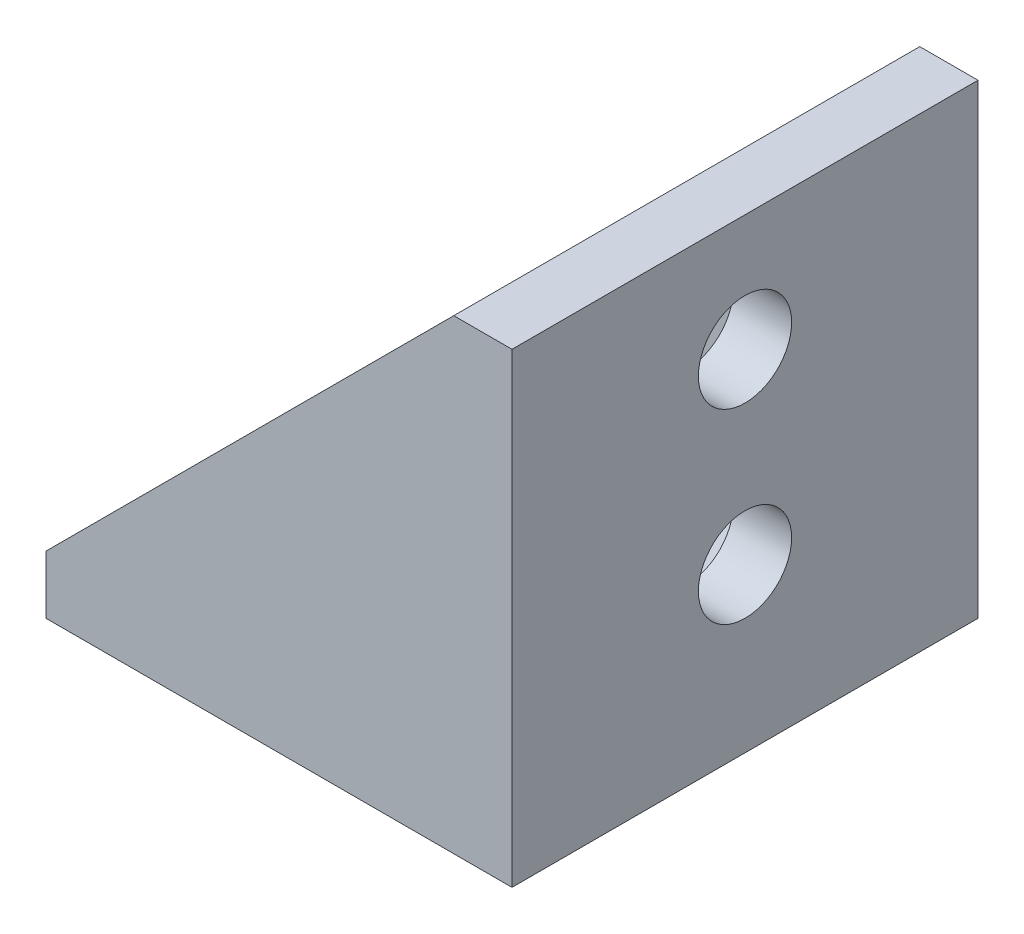
ISO-10303-21;
HEADER;
FILE_DESCRIPTION(('STEP AP214'),'2;1');
FILE_NAME('part.step','',(''),(''),'','','');
FILE_SCHEMA(('AUTOMOTIVE_DESIGN { 1 0 10303 214 1 1 1 1 }'));
ENDSEC;
DATA;
#1=APPLICATION_CONTEXT('core data for automotive mechanical design processes');
#2=APPLICATION_PROTOCOL_DEFINITION('international standard','automotive_design',2000,#1);
#3=PRODUCT_CONTEXT('',#1,'mechanical');
#4=PRODUCT('Part','Part','',(#3));
#5=PRODUCT_RELATED_PRODUCT_CATEGORY('part','',(#4));
#6=PRODUCT_DEFINITION_FORMATION('','',#4);
#7=PRODUCT_DEFINITION_CONTEXT('part definition',#1,'design');
#8=PRODUCT_DEFINITION('design','',#6,#7);
#9=PRODUCT_DEFINITION_SHAPE('','',#8);
#10=(LENGTH_UNIT() NAMED_UNIT(*) SI_UNIT(.MILLI.,.METRE.));
#11=(NAMED_UNIT(*) PLANE_ANGLE_UNIT() SI_UNIT($,.RADIAN.));
#12=(NAMED_UNIT(*) SI_UNIT($,.STERADIAN.) SOLID_ANGLE_UNIT());
#13=UNCERTAINTY_MEASURE_WITH_UNIT(LENGTH_MEASURE(1.E-05),#10,'distance_accuracy_value','');
#14=(GEOMETRIC_REPRESENTATION_CONTEXT(3) GLOBAL_UNCERTAINTY_ASSIGNED_CONTEXT((#13)) GLOBAL_UNIT_ASSIGNED_CONTEXT((#10,
#11,#12)) REPRESENTATION_CONTEXT('',''));
#15=CARTESIAN_POINT('',(0.,0.,0.));
#16=DIRECTION('',(0.,0.,1.));
#17=DIRECTION('',(1.,0.,0.));
#18=AXIS2_PLACEMENT_3D('',#15,#16,#17);
#19=CARTESIAN_POINT('',(17.5,20.,-20.));
#20=DIRECTION('',(-0.707106781186548,0.707106781186548,0.));
#21=DIRECTION('',(-0.707106781186548,-0.707106781186548,0.));
#22=AXIS2_PLACEMENT_3D('',#19,#20,#21);
#23=PLANE('',#22);
#24=DIRECTION('',(0.,0.,1.));
#25=VECTOR('',#24,1.);
#26=CARTESIAN_POINT('',(0.,2.5,-20.));
#27=LINE('',#26,#25);
#28=CARTESIAN_POINT('',(0.,2.5,-20.));
#29=VERTEX_POINT('',#28);
#30=CARTESIAN_POINT('',(0.,2.5,-18.3));
#31=VERTEX_POINT('',#30);
#32=EDGE_CURVE('E59',#29,#31,#27,.T.);
#33=ORIENTED_EDGE('',*,*,#32,.T.);
#34=DIRECTION('',(0.707106781186548,0.707106781186548,0.));
#35=VECTOR('',#34,1.);
#36=CARTESIAN_POINT('',(17.5,20.,-18.3));
#37=LINE('',#36,#35);
#38=CARTESIAN_POINT('',(17.5,20.,-18.3));
#39=VERTEX_POINT('',#38);
#40=EDGE_CURVE('E11',#31,#39,#37,.T.);
#41=ORIENTED_EDGE('',*,*,#40,.T.);
#42=DIRECTION('',(0.,0.,1.));
#43=VECTOR('',#42,1.);
#44=CARTESIAN_POINT('',(17.5,20.,-20.));
#45=LINE('',#44,#43);
#46=CARTESIAN_POINT('',(17.5,20.,-20.));
#47=VERTEX_POINT('',#46);
#48=EDGE_CURVE('E148',#47,#39,#45,.T.);
#49=ORIENTED_EDGE('',*,*,#48,.F.);
#50=DIRECTION('',(-0.707106781186548,-0.707106781186548,0.));
#51=VECTOR('',#50,1.);
#52=CARTESIAN_POINT('',(17.5,20.,-20.));
#53=LINE('',#52,#51);
#54=EDGE_CURVE('E124',#47,#29,#53,.T.);
#55=ORIENTED_EDGE('',*,*,#54,.T.);
#56=EDGE_LOOP('',(#33,#41,#49,#55));
#57=FACE_BOUND('',#56,.T.);
#58=ADVANCED_FACE('F35',(#57),#23,.T.);
#59=CARTESIAN_POINT('',(17.5,20.,-1.7));
#60=VERTEX_POINT('',#59);
#61=CARTESIAN_POINT('',(17.5,20.,0.));
#62=VERTEX_POINT('',#61);
#63=EDGE_CURVE('E116',#60,#62,#45,.T.);
#64=ORIENTED_EDGE('',*,*,#63,.F.);
#65=DIRECTION('',(-0.707106781186548,-0.707106781186548,0.));
#66=VECTOR('',#65,1.);
#67=CARTESIAN_POINT('',(17.5,20.,-1.7));
#68=LINE('',#67,#66);
#69=CARTESIAN_POINT('',(0.,2.5,-1.7));
#70=VERTEX_POINT('',#69);
#71=EDGE_CURVE('E43',#60,#70,#68,.T.);
#72=ORIENTED_EDGE('',*,*,#71,.T.);
#73=CARTESIAN_POINT('',(0.,2.5,0.));
#74=VERTEX_POINT('',#73);
#75=EDGE_CURVE('E85',#70,#74,#27,.T.);
#76=ORIENTED_EDGE('',*,*,#75,.T.);
#77=DIRECTION('',(-0.707106781186548,-0.707106781186548,0.));
#78=VECTOR('',#77,1.);
#79=CARTESIAN_POINT('',(17.5,20.,0.));
#80=LINE('',#79,#78);
#81=EDGE_CURVE('E144',#62,#74,#80,.T.);
#82=ORIENTED_EDGE('',*,*,#81,.F.);
#83=EDGE_LOOP('',(#64,#72,#76,#82));
#84=FACE_BOUND('',#83,.T.);
#85=ADVANCED_FACE('F153',(#84),#23,.T.);
#86=CARTESIAN_POINT('',(0.,2.5,-20.));
#87=DIRECTION('',(-1.,0.,0.));
#88=DIRECTION('',(0.,-1.,0.));
#89=AXIS2_PLACEMENT_3D('',#86,#87,#88);
#90=PLANE('',#89);
#91=DIRECTION('',(0.,-1.,0.));
#92=VECTOR('',#91,1.);
#93=CARTESIAN_POINT('',(0.,2.5,0.));
#94=LINE('',#93,#92);
#95=CARTESIAN_POINT('',(0.,0.,0.));
#96=VERTEX_POINT('',#95);
#97=EDGE_CURVE('E134',#74,#96,#94,.T.);
#98=ORIENTED_EDGE('',*,*,#97,.F.);
#99=ORIENTED_EDGE('',*,*,#75,.F.);
#100=DIRECTION('',(0.,0.,-1.));
#101=VECTOR('',#100,1.);
#102=CARTESIAN_POINT('',(0.,2.5,-20.));
#103=LINE('',#102,#101);
#104=EDGE_CURVE('E160',#70,#31,#103,.T.);
#105=ORIENTED_EDGE('',*,*,#104,.T.);
#106=ORIENTED_EDGE('',*,*,#32,.F.);
#107=DIRECTION('',(0.,-1.,0.));
#108=VECTOR('',#107,1.);
#109=CARTESIAN_POINT('',(0.,2.5,-20.));
#110=LINE('',#109,#108);
#111=CARTESIAN_POINT('',(0.,0.,-20.));
#112=VERTEX_POINT('',#111);
#113=EDGE_CURVE('E129',#29,#112,#110,.T.);
#114=ORIENTED_EDGE('',*,*,#113,.T.);
#115=DIRECTION('',(0.,0.,1.));
#116=VECTOR('',#115,1.);
#117=CARTESIAN_POINT('',(0.,0.,-20.));
#118=LINE('',#117,#116);
#119=EDGE_CURVE('E93',#112,#96,#118,.T.);
#120=ORIENTED_EDGE('',*,*,#119,.T.);
#121=EDGE_LOOP('',(#98,#99,#105,#106,#114,#120));
#122=FACE_BOUND('',#121,.T.);
#123=ADVANCED_FACE('F37',(#122),#90,.T.);
#124=CARTESIAN_POINT('',(20.,20.,-20.));
#125=DIRECTION('',(0.,1.,0.));
#126=DIRECTION('',(0.,0.,1.));
#127=AXIS2_PLACEMENT_3D('',#124,#125,#126);
#128=PLANE('',#127);
#129=DIRECTION('',(-1.,0.,0.));
#130=VECTOR('',#129,1.);
#131=CARTESIAN_POINT('',(20.,20.,0.));
#132=LINE('',#131,#130);
#133=CARTESIAN_POINT('',(20.,20.,0.));
#134=VERTEX_POINT('',#133);
#135=EDGE_CURVE('E111',#134,#62,#132,.T.);
#136=ORIENTED_EDGE('',*,*,#135,.F.);
#137=DIRECTION('',(0.,0.,1.));
#138=VECTOR('',#137,1.);
#139=CARTESIAN_POINT('',(20.,20.,-20.));
#140=LINE('',#139,#138);
#141=CARTESIAN_POINT('',(20.,20.,-20.));
#142=VERTEX_POINT('',#141);
#143=EDGE_CURVE('E104',#142,#134,#140,.T.);
#144=ORIENTED_EDGE('',*,*,#143,.F.);
#145=DIRECTION('',(-1.,0.,0.));
#146=VECTOR('',#145,1.);
#147=CARTESIAN_POINT('',(20.,20.,-20.));
#148=LINE('',#147,#146);
#149=EDGE_CURVE('E108',#142,#47,#148,.T.);
#150=ORIENTED_EDGE('',*,*,#149,.T.);
#151=ORIENTED_EDGE('',*,*,#48,.T.);
#152=DIRECTION('',(0.,0.,1.));
#153=VECTOR('',#152,1.);
#154=CARTESIAN_POINT('',(17.5,20.,-20.));
#155=LINE('',#154,#153);
#156=EDGE_CURVE('E168',#39,#60,#155,.T.);
#157=ORIENTED_EDGE('',*,*,#156,.T.);
#158=ORIENTED_EDGE('',*,*,#63,.T.);
#159=EDGE_LOOP('',(#136,#144,#150,#151,#157,#158));
#160=FACE_BOUND('',#159,.T.);
#161=ADVANCED_FACE('F106',(#160),#128,.T.);
#162=CARTESIAN_POINT('',(20.,0.,-20.));
#163=DIRECTION('',(1.,0.,0.));
#164=DIRECTION('',(0.,0.,-1.));
#165=AXIS2_PLACEMENT_3D('',#162,#163,#164);
#166=PLANE('',#165);
#167=CARTESIAN_POINT('',(20.,15.,-10.));
#168=DIRECTION('',(1.,0.,0.));
#169=DIRECTION('',(0.,0.,-1.));
#170=AXIS2_PLACEMENT_3D('',#167,#168,#169);
#171=CIRCLE('',#170,2.);
#172=CARTESIAN_POINT('',(20.,15.,-12.));
#173=VERTEX_POINT('',#172);
#174=EDGE_CURVE('E183',#173,#173,#171,.T.);
#175=ORIENTED_EDGE('',*,*,#174,.F.);
#176=EDGE_LOOP('',(#175));
#177=FACE_BOUND('',#176,.T.);
#178=CARTESIAN_POINT('',(20.,7.,-10.));
#179=DIRECTION('',(1.,0.,0.));
#180=DIRECTION('',(0.,0.,-1.));
#181=AXIS2_PLACEMENT_3D('',#178,#179,#180);
#182=CIRCLE('',#181,2.);
#183=CARTESIAN_POINT('',(20.,7.,-12.));
#184=VERTEX_POINT('',#183);
#185=EDGE_CURVE('E191',#184,#184,#182,.T.);
#186=ORIENTED_EDGE('',*,*,#185,.F.);
#187=EDGE_LOOP('',(#186));
#188=FACE_BOUND('',#187,.T.);
#189=DIRECTION('',(0.,1.,0.));
#190=VECTOR('',#189,1.);
#191=CARTESIAN_POINT('',(20.,0.,0.));
#192=LINE('',#191,#190);
#193=CARTESIAN_POINT('',(20.,0.,0.));
#194=VERTEX_POINT('',#193);
#195=EDGE_CURVE('E141',#194,#134,#192,.T.);
#196=ORIENTED_EDGE('',*,*,#195,.F.);
#197=DIRECTION('',(0.,0.,1.));
#198=VECTOR('',#197,1.);
#199=CARTESIAN_POINT('',(20.,0.,-20.));
#200=LINE('',#199,#198);
#201=CARTESIAN_POINT('',(20.,0.,-20.));
#202=VERTEX_POINT('',#201);
#203=EDGE_CURVE('E117',#202,#194,#200,.T.);
#204=ORIENTED_EDGE('',*,*,#203,.F.);
#205=DIRECTION('',(0.,1.,0.));
#206=VECTOR('',#205,1.);
#207=CARTESIAN_POINT('',(20.,0.,-20.));
#208=LINE('',#207,#206);
#209=EDGE_CURVE('E122',#202,#142,#208,.T.);
#210=ORIENTED_EDGE('',*,*,#209,.T.);
#211=ORIENTED_EDGE('',*,*,#143,.T.);
#212=EDGE_LOOP('',(#196,#204,#210,#211));
#213=FACE_BOUND('',#212,.T.);
#214=ADVANCED_FACE('F126',(#177,#188,#213),#166,.T.);
#215=CARTESIAN_POINT('',(0.,0.,-20.));
#216=DIRECTION('',(0.,-1.,0.));
#217=DIRECTION('',(0.,0.,-1.));
#218=AXIS2_PLACEMENT_3D('',#215,#216,#217);
#219=PLANE('',#218);
#220=CARTESIAN_POINT('',(5.,0.,-9.95403948189731));
#221=DIRECTION('',(0.,1.,0.));
#222=DIRECTION('',(0.,0.,1.));
#223=AXIS2_PLACEMENT_3D('',#220,#221,#222);
#224=CIRCLE('',#223,2.);
#225=CARTESIAN_POINT('',(5.,0.,-7.95403948189731));
#226=VERTEX_POINT('',#225);
#227=EDGE_CURVE('E171',#226,#226,#224,.T.);
#228=ORIENTED_EDGE('',*,*,#227,.T.);
#229=EDGE_LOOP('',(#228));
#230=FACE_BOUND('',#229,.T.);
#231=CARTESIAN_POINT('',(13.,0.,-9.95403948189731));
#232=DIRECTION('',(0.,1.,0.));
#233=DIRECTION('',(0.,0.,1.));
#234=AXIS2_PLACEMENT_3D('',#231,#232,#233);
#235=CIRCLE('',#234,2.);
#236=CARTESIAN_POINT('',(13.,0.,-7.95403948189731));
#237=VERTEX_POINT('',#236);
#238=EDGE_CURVE('E182',#237,#237,#235,.T.);
#239=ORIENTED_EDGE('',*,*,#238,.T.);
#240=EDGE_LOOP('',(#239));
#241=FACE_BOUND('',#240,.T.);
#242=DIRECTION('',(1.,0.,0.));
#243=VECTOR('',#242,1.);
#244=CARTESIAN_POINT('',(0.,0.,0.));
#245=LINE('',#244,#243);
#246=EDGE_CURVE('E137',#96,#194,#245,.T.);
#247=ORIENTED_EDGE('',*,*,#246,.F.);
#248=ORIENTED_EDGE('',*,*,#119,.F.);
#249=DIRECTION('',(1.,0.,0.));
#250=VECTOR('',#249,1.);
#251=CARTESIAN_POINT('',(0.,0.,-20.));
#252=LINE('',#251,#250);
#253=EDGE_CURVE('E127',#112,#202,#252,.T.);
#254=ORIENTED_EDGE('',*,*,#253,.T.);
#255=ORIENTED_EDGE('',*,*,#203,.T.);
#256=EDGE_LOOP('',(#247,#248,#254,#255));
#257=FACE_BOUND('',#256,.T.);
#258=ADVANCED_FACE('F163',(#230,#241,#257),#219,.T.);
#259=CARTESIAN_POINT('',(0.,0.,-20.));
#260=DIRECTION('',(0.,0.,1.));
#261=DIRECTION('',(1.,0.,0.));
#262=AXIS2_PLACEMENT_3D('',#259,#260,#261);
#263=PLANE('',#262);
#264=ORIENTED_EDGE('',*,*,#113,.F.);
#265=ORIENTED_EDGE('',*,*,#54,.F.);
#266=ORIENTED_EDGE('',*,*,#149,.F.);
#267=ORIENTED_EDGE('',*,*,#209,.F.);
#268=ORIENTED_EDGE('',*,*,#253,.F.);
#269=EDGE_LOOP('',(#264,#265,#266,#267,#268));
#270=FACE_BOUND('',#269,.T.);
#271=ADVANCED_FACE('F121',(#270),#263,.F.);
#272=CARTESIAN_POINT('',(0.,0.,0.));
#273=DIRECTION('',(0.,0.,1.));
#274=DIRECTION('',(1.,0.,0.));
#275=AXIS2_PLACEMENT_3D('',#272,#273,#274);
#276=PLANE('',#275);
#277=ORIENTED_EDGE('',*,*,#97,.T.);
#278=ORIENTED_EDGE('',*,*,#246,.T.);
#279=ORIENTED_EDGE('',*,*,#195,.T.);
#280=ORIENTED_EDGE('',*,*,#135,.T.);
#281=ORIENTED_EDGE('',*,*,#81,.T.);
#282=EDGE_LOOP('',(#277,#278,#279,#280,#281));
#283=FACE_BOUND('',#282,.T.);
#284=ADVANCED_FACE('F162',(#283),#276,.T.);
#285=CARTESIAN_POINT('',(20.,2.5,-18.3));
#286=DIRECTION('',(0.,0.,1.));
#287=DIRECTION('',(1.,0.,0.));
#288=AXIS2_PLACEMENT_3D('',#285,#286,#287);
#289=PLANE('',#288);
#290=DIRECTION('',(1.,0.,0.));
#291=VECTOR('',#290,1.);
#292=CARTESIAN_POINT('',(20.,2.5,-18.3));
#293=LINE('',#292,#291);
#294=CARTESIAN_POINT('',(17.5,2.5,-18.3));
#295=VERTEX_POINT('',#294);
#296=EDGE_CURVE('E170',#31,#295,#293,.T.);
#297=ORIENTED_EDGE('',*,*,#296,.T.);
#298=DIRECTION('',(0.,1.,0.));
#299=VECTOR('',#298,1.);
#300=CARTESIAN_POINT('',(17.5,2.5,-18.3));
#301=LINE('',#300,#299);
#302=EDGE_CURVE('E138',#295,#39,#301,.T.);
#303=ORIENTED_EDGE('',*,*,#302,.T.);
#304=ORIENTED_EDGE('',*,*,#40,.F.);
#305=EDGE_LOOP('',(#297,#303,#304));
#306=FACE_BOUND('',#305,.T.);
#307=ADVANCED_FACE('F209',(#306),#289,.T.);
#308=CARTESIAN_POINT('',(17.5,2.5,-20.));
#309=DIRECTION('',(-1.,0.,0.));
#310=DIRECTION('',(0.,0.,1.));
#311=AXIS2_PLACEMENT_3D('',#308,#309,#310);
#312=PLANE('',#311);
#313=CARTESIAN_POINT('',(17.5,15.,-10.));
#314=DIRECTION('',(-1.,0.,0.));
#315=DIRECTION('',(0.,0.,1.));
#316=AXIS2_PLACEMENT_3D('',#313,#314,#315);
#317=CIRCLE('',#316,2.);
#318=CARTESIAN_POINT('',(17.5,15.,-8.));
#319=VERTEX_POINT('',#318);
#320=EDGE_CURVE('E194',#319,#319,#317,.T.);
#321=ORIENTED_EDGE('',*,*,#320,.F.);
#322=EDGE_LOOP('',(#321));
#323=FACE_BOUND('',#322,.T.);
#324=CARTESIAN_POINT('',(17.5,7.,-10.));
#325=DIRECTION('',(-1.,0.,0.));
#326=DIRECTION('',(0.,0.,1.));
#327=AXIS2_PLACEMENT_3D('',#324,#325,#326);
#328=CIRCLE('',#327,2.);
#329=CARTESIAN_POINT('',(17.5,7.,-8.));
#330=VERTEX_POINT('',#329);
#331=EDGE_CURVE('E195',#330,#330,#328,.T.);
#332=ORIENTED_EDGE('',*,*,#331,.F.);
#333=EDGE_LOOP('',(#332));
#334=FACE_BOUND('',#333,.T.);
#335=ORIENTED_EDGE('',*,*,#156,.F.);
#336=ORIENTED_EDGE('',*,*,#302,.F.);
#337=DIRECTION('',(0.,0.,1.));
#338=VECTOR('',#337,1.);
#339=CARTESIAN_POINT('',(17.5,2.5,-20.));
#340=LINE('',#339,#338);
#341=CARTESIAN_POINT('',(17.5,2.5,-1.7));
#342=VERTEX_POINT('',#341);
#343=EDGE_CURVE('E175',#295,#342,#340,.T.);
#344=ORIENTED_EDGE('',*,*,#343,.T.);
#345=DIRECTION('',(0.,1.,0.));
#346=VECTOR('',#345,1.);
#347=CARTESIAN_POINT('',(17.5,2.5,-1.7));
#348=LINE('',#347,#346);
#349=EDGE_CURVE('E50',#342,#60,#348,.T.);
#350=ORIENTED_EDGE('',*,*,#349,.T.);
#351=EDGE_LOOP('',(#335,#336,#344,#350));
#352=FACE_BOUND('',#351,.T.);
#353=ADVANCED_FACE('F205',(#323,#334,#352),#312,.T.);
#354=CARTESIAN_POINT('',(20.,2.5,-1.7));
#355=DIRECTION('',(0.,0.,-1.));
#356=DIRECTION('',(-1.,0.,0.));
#357=AXIS2_PLACEMENT_3D('',#354,#355,#356);
#358=PLANE('',#357);
#359=ORIENTED_EDGE('',*,*,#349,.F.);
#360=DIRECTION('',(-1.,0.,0.));
#361=VECTOR('',#360,1.);
#362=CARTESIAN_POINT('',(20.,2.5,-1.7));
#363=LINE('',#362,#361);
#364=EDGE_CURVE('E173',#342,#70,#363,.T.);
#365=ORIENTED_EDGE('',*,*,#364,.T.);
#366=ORIENTED_EDGE('',*,*,#71,.F.);
#367=EDGE_LOOP('',(#359,#365,#366));
#368=FACE_BOUND('',#367,.T.);
#369=ADVANCED_FACE('F208',(#368),#358,.T.);
#370=CARTESIAN_POINT('',(0.,2.5,0.));
#371=DIRECTION('',(0.,-1.,0.));
#372=DIRECTION('',(0.,0.,-1.));
#373=AXIS2_PLACEMENT_3D('',#370,#371,#372);
#374=PLANE('',#373);
#375=CARTESIAN_POINT('',(5.,2.5,-9.95403948189731));
#376=DIRECTION('',(0.,-1.,0.));
#377=DIRECTION('',(0.,0.,-1.));
#378=AXIS2_PLACEMENT_3D('',#375,#376,#377);
#379=CIRCLE('',#378,2.);
#380=CARTESIAN_POINT('',(5.,2.5,-11.9540394818973));
#381=VERTEX_POINT('',#380);
#382=EDGE_CURVE('E186',#381,#381,#379,.T.);
#383=ORIENTED_EDGE('',*,*,#382,.T.);
#384=EDGE_LOOP('',(#383));
#385=FACE_BOUND('',#384,.T.);
#386=CARTESIAN_POINT('',(13.,2.5,-9.95403948189731));
#387=DIRECTION('',(0.,-1.,0.));
#388=DIRECTION('',(0.,0.,-1.));
#389=AXIS2_PLACEMENT_3D('',#386,#387,#388);
#390=CIRCLE('',#389,2.);
#391=CARTESIAN_POINT('',(13.,2.5,-11.9540394818973));
#392=VERTEX_POINT('',#391);
#393=EDGE_CURVE('E179',#392,#392,#390,.T.);
#394=ORIENTED_EDGE('',*,*,#393,.T.);
#395=EDGE_LOOP('',(#394));
#396=FACE_BOUND('',#395,.T.);
#397=ORIENTED_EDGE('',*,*,#296,.F.);
#398=ORIENTED_EDGE('',*,*,#104,.F.);
#399=ORIENTED_EDGE('',*,*,#364,.F.);
#400=ORIENTED_EDGE('',*,*,#343,.F.);
#401=EDGE_LOOP('',(#397,#398,#399,#400));
#402=FACE_BOUND('',#401,.T.);
#403=ADVANCED_FACE('F223',(#385,#396,#402),#374,.F.);
#404=CARTESIAN_POINT('',(13.,20.001,-9.95403948189731));
#405=DIRECTION('',(0.,-1.,0.));
#406=DIRECTION('',(0.,0.,-1.));
#407=AXIS2_PLACEMENT_3D('',#404,#405,#406);
#408=CYLINDRICAL_SURFACE('',#407,2.);
#409=ORIENTED_EDGE('',*,*,#238,.F.);
#410=EDGE_LOOP('',(#409));
#411=FACE_BOUND('',#410,.T.);
#412=ORIENTED_EDGE('',*,*,#393,.F.);
#413=EDGE_LOOP('',(#412));
#414=FACE_BOUND('',#413,.T.);
#415=ADVANCED_FACE('F229',(#411,#414),#408,.F.);
#416=CARTESIAN_POINT('',(5.,20.001,-9.95403948189731));
#417=DIRECTION('',(0.,-1.,0.));
#418=DIRECTION('',(0.,0.,-1.));
#419=AXIS2_PLACEMENT_3D('',#416,#417,#418);
#420=CYLINDRICAL_SURFACE('',#419,2.);
#421=ORIENTED_EDGE('',*,*,#227,.F.);
#422=EDGE_LOOP('',(#421));
#423=FACE_BOUND('',#422,.T.);
#424=ORIENTED_EDGE('',*,*,#382,.F.);
#425=EDGE_LOOP('',(#424));
#426=FACE_BOUND('',#425,.T.);
#427=ADVANCED_FACE('F255',(#423,#426),#420,.F.);
#428=CARTESIAN_POINT('',(20.001,7.,-10.));
#429=DIRECTION('',(-1.,0.,0.));
#430=DIRECTION('',(0.,0.,1.));
#431=AXIS2_PLACEMENT_3D('',#428,#429,#430);
#432=CYLINDRICAL_SURFACE('',#431,2.);
#433=ORIENTED_EDGE('',*,*,#185,.T.);
#434=EDGE_LOOP('',(#433));
#435=FACE_BOUND('',#434,.T.);
#436=ORIENTED_EDGE('',*,*,#331,.T.);
#437=EDGE_LOOP('',(#436));
#438=FACE_BOUND('',#437,.T.);
#439=ADVANCED_FACE('F262',(#435,#438),#432,.F.);
#440=CARTESIAN_POINT('',(20.001,15.,-10.));
#441=DIRECTION('',(-1.,0.,0.));
#442=DIRECTION('',(0.,0.,1.));
#443=AXIS2_PLACEMENT_3D('',#440,#441,#442);
#444=CYLINDRICAL_SURFACE('',#443,2.);
#445=ORIENTED_EDGE('',*,*,#174,.T.);
#446=EDGE_LOOP('',(#445));
#447=FACE_BOUND('',#446,.T.);
#448=ORIENTED_EDGE('',*,*,#320,.T.);
#449=EDGE_LOOP('',(#448));
#450=FACE_BOUND('',#449,.T.);
#451=ADVANCED_FACE('F203',(#447,#450),#444,.F.);
#452=CLOSED_SHELL('',(#58,#85,#123,#161,#214,#258,#271,#284,#307,#353,#369,#403,#415,#427,#439,#451));
#453=MANIFOLD_SOLID_BREP('B2',#452);
#454=ADVANCED_BREP_SHAPE_REPRESENTATION('',(#18,#453),#14);
#455=SHAPE_DEFINITION_REPRESENTATION(#9,#454);
ENDSEC;
END-ISO-10303-21;
